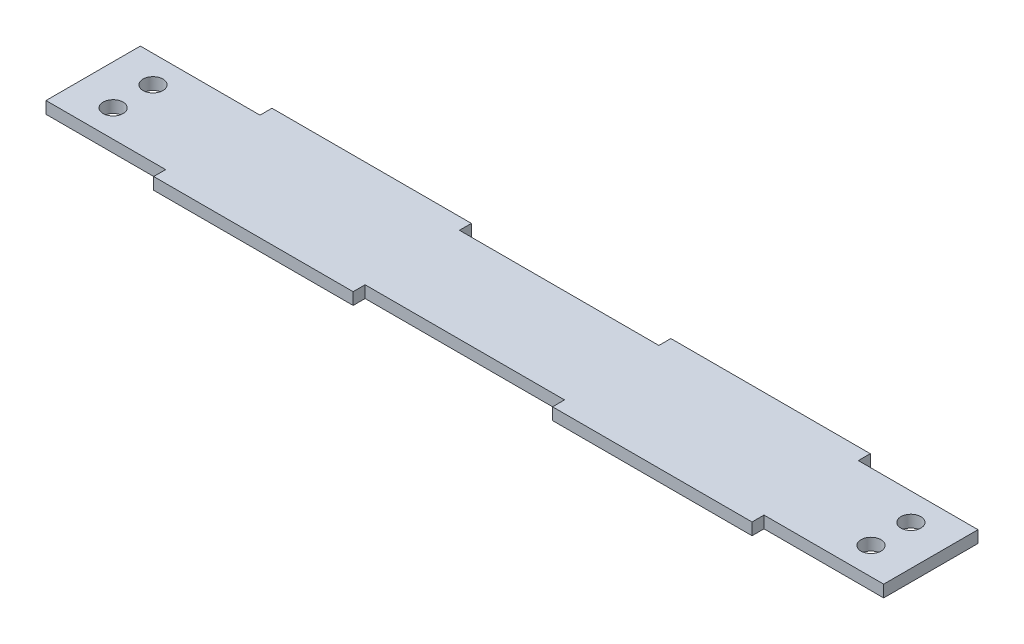
ISO-10303-21;
HEADER;
FILE_DESCRIPTION(('STEP AP214'),'2;1');
FILE_NAME('part.step','',(''),(''),'','','');
FILE_SCHEMA(('AUTOMOTIVE_DESIGN { 1 0 10303 214 1 1 1 1 }'));
ENDSEC;
DATA;
#1=APPLICATION_CONTEXT('core data for automotive mechanical design processes');
#2=APPLICATION_PROTOCOL_DEFINITION('international standard','automotive_design',2000,#1);
#3=PRODUCT_CONTEXT('',#1,'mechanical');
#4=PRODUCT('Part','Part','',(#3));
#5=PRODUCT_RELATED_PRODUCT_CATEGORY('part','',(#4));
#6=PRODUCT_DEFINITION_FORMATION('','',#4);
#7=PRODUCT_DEFINITION_CONTEXT('part definition',#1,'design');
#8=PRODUCT_DEFINITION('design','',#6,#7);
#9=PRODUCT_DEFINITION_SHAPE('','',#8);
#10=(LENGTH_UNIT() NAMED_UNIT(*) SI_UNIT(.MILLI.,.METRE.));
#11=(NAMED_UNIT(*) PLANE_ANGLE_UNIT() SI_UNIT($,.RADIAN.));
#12=(NAMED_UNIT(*) SI_UNIT($,.STERADIAN.) SOLID_ANGLE_UNIT());
#13=UNCERTAINTY_MEASURE_WITH_UNIT(LENGTH_MEASURE(1.E-05),#10,'distance_accuracy_value','');
#14=(GEOMETRIC_REPRESENTATION_CONTEXT(3) GLOBAL_UNCERTAINTY_ASSIGNED_CONTEXT((#13)) GLOBAL_UNIT_ASSIGNED_CONTEXT((#10,
#11,#12)) REPRESENTATION_CONTEXT('',''));
#15=CARTESIAN_POINT('',(0.,0.,0.));
#16=DIRECTION('',(0.,0.,1.));
#17=DIRECTION('',(1.,0.,0.));
#18=AXIS2_PLACEMENT_3D('',#15,#16,#17);
#19=CARTESIAN_POINT('',(0.,3.,0.));
#20=DIRECTION('',(0.,1.,0.));
#21=DIRECTION('',(0.,0.,1.));
#22=AXIS2_PLACEMENT_3D('',#19,#20,#21);
#23=PLANE('',#22);
#24=CARTESIAN_POINT('',(94.9999999999999,3.,-5.00000000000078));
#25=DIRECTION('',(0.,1.,0.));
#26=DIRECTION('',(0.,0.,1.));
#27=AXIS2_PLACEMENT_3D('',#24,#25,#26);
#28=CIRCLE('',#27,2.50000000000002);
#29=CARTESIAN_POINT('',(94.9999999999999,3.,-2.50000000000076));
#30=VERTEX_POINT('',#29);
#31=EDGE_CURVE('E397',#30,#30,#28,.T.);
#32=ORIENTED_EDGE('',*,*,#31,.F.);
#33=EDGE_LOOP('',(#32));
#34=FACE_BOUND('',#33,.T.);
#35=CARTESIAN_POINT('',(-95.,3.,-5.));
#36=DIRECTION('',(0.,1.,0.));
#37=DIRECTION('',(0.,0.,1.));
#38=AXIS2_PLACEMENT_3D('',#35,#36,#37);
#39=CIRCLE('',#38,2.50000000000001);
#40=CARTESIAN_POINT('',(-95.,3.,-2.49999999999999));
#41=VERTEX_POINT('',#40);
#42=EDGE_CURVE('E208',#41,#41,#39,.T.);
#43=ORIENTED_EDGE('',*,*,#42,.F.);
#44=EDGE_LOOP('',(#43));
#45=FACE_BOUND('',#44,.T.);
#46=DIRECTION('',(0.,0.,1.));
#47=VECTOR('',#46,1.);
#48=CARTESIAN_POINT('',(-105.,3.,-11.825));
#49=LINE('',#48,#47);
#50=CARTESIAN_POINT('',(-105.,3.,-11.825));
#51=VERTEX_POINT('',#50);
#52=CARTESIAN_POINT('',(-105.,3.,11.8250000000001));
#53=VERTEX_POINT('',#52);
#54=EDGE_CURVE('E243',#51,#53,#49,.T.);
#55=ORIENTED_EDGE('',*,*,#54,.T.);
#56=DIRECTION('',(1.,0.,0.));
#57=VECTOR('',#56,1.);
#58=CARTESIAN_POINT('',(-105.,3.,11.8250000000001));
#59=LINE('',#58,#57);
#60=CARTESIAN_POINT('',(-75.,3.,11.8250000000001));
#61=VERTEX_POINT('',#60);
#62=EDGE_CURVE('E131',#53,#61,#59,.T.);
#63=ORIENTED_EDGE('',*,*,#62,.T.);
#64=DIRECTION('',(0.,0.,1.));
#65=VECTOR('',#64,1.);
#66=CARTESIAN_POINT('',(-75.,3.,11.8250000000001));
#67=LINE('',#66,#65);
#68=CARTESIAN_POINT('',(-75.,3.,14.8250000000001));
#69=VERTEX_POINT('',#68);
#70=EDGE_CURVE('E294',#61,#69,#67,.T.);
#71=ORIENTED_EDGE('',*,*,#70,.T.);
#72=DIRECTION('',(1.,0.,0.));
#73=VECTOR('',#72,1.);
#74=CARTESIAN_POINT('',(-75.,3.,14.8250000000001));
#75=LINE('',#74,#73);
#76=CARTESIAN_POINT('',(-25.,3.,14.825));
#77=VERTEX_POINT('',#76);
#78=EDGE_CURVE('E313',#69,#77,#75,.T.);
#79=ORIENTED_EDGE('',*,*,#78,.T.);
#80=DIRECTION('',(0.,0.,-1.));
#81=VECTOR('',#80,1.);
#82=CARTESIAN_POINT('',(-25.,3.,14.825));
#83=LINE('',#82,#81);
#84=CARTESIAN_POINT('',(-25.,3.,11.825));
#85=VERTEX_POINT('',#84);
#86=EDGE_CURVE('E310',#77,#85,#83,.T.);
#87=ORIENTED_EDGE('',*,*,#86,.T.);
#88=DIRECTION('',(1.,0.,0.));
#89=VECTOR('',#88,1.);
#90=CARTESIAN_POINT('',(-25.,3.,11.825));
#91=LINE('',#90,#89);
#92=CARTESIAN_POINT('',(25.0000000000001,3.,11.825));
#93=VERTEX_POINT('',#92);
#94=EDGE_CURVE('E312',#85,#93,#91,.T.);
#95=ORIENTED_EDGE('',*,*,#94,.T.);
#96=DIRECTION('',(0.,0.,1.));
#97=VECTOR('',#96,1.);
#98=CARTESIAN_POINT('',(25.0000000000001,3.,11.825));
#99=LINE('',#98,#97);
#100=CARTESIAN_POINT('',(25.0000000000001,3.,14.825));
#101=VERTEX_POINT('',#100);
#102=EDGE_CURVE('E315',#93,#101,#99,.T.);
#103=ORIENTED_EDGE('',*,*,#102,.T.);
#104=DIRECTION('',(1.,0.,0.));
#105=VECTOR('',#104,1.);
#106=CARTESIAN_POINT('',(25.0000000000001,3.,14.825));
#107=LINE('',#106,#105);
#108=CARTESIAN_POINT('',(75.0000000000001,3.,14.825));
#109=VERTEX_POINT('',#108);
#110=EDGE_CURVE('E321',#101,#109,#107,.T.);
#111=ORIENTED_EDGE('',*,*,#110,.T.);
#112=DIRECTION('',(0.,0.,-1.));
#113=VECTOR('',#112,1.);
#114=CARTESIAN_POINT('',(75.0000000000001,3.,14.825));
#115=LINE('',#114,#113);
#116=CARTESIAN_POINT('',(75.0000000000001,3.,11.825));
#117=VERTEX_POINT('',#116);
#118=EDGE_CURVE('E323',#109,#117,#115,.T.);
#119=ORIENTED_EDGE('',*,*,#118,.T.);
#120=DIRECTION('',(1.,0.,0.));
#121=VECTOR('',#120,1.);
#122=CARTESIAN_POINT('',(75.0000000000001,3.,11.825));
#123=LINE('',#122,#121);
#124=CARTESIAN_POINT('',(105.,3.,11.825));
#125=VERTEX_POINT('',#124);
#126=EDGE_CURVE('E325',#117,#125,#123,.T.);
#127=ORIENTED_EDGE('',*,*,#126,.T.);
#128=DIRECTION('',(0.,0.,-1.));
#129=VECTOR('',#128,1.);
#130=CARTESIAN_POINT('',(105.,3.,11.825));
#131=LINE('',#130,#129);
#132=CARTESIAN_POINT('',(105.,3.,-11.825));
#133=VERTEX_POINT('',#132);
#134=EDGE_CURVE('E327',#125,#133,#131,.T.);
#135=ORIENTED_EDGE('',*,*,#134,.T.);
#136=DIRECTION('',(-1.,0.,0.));
#137=VECTOR('',#136,1.);
#138=CARTESIAN_POINT('',(105.,3.,-11.825));
#139=LINE('',#138,#137);
#140=CARTESIAN_POINT('',(75.0000000000001,3.,-11.825));
#141=VERTEX_POINT('',#140);
#142=EDGE_CURVE('E329',#133,#141,#139,.T.);
#143=ORIENTED_EDGE('',*,*,#142,.T.);
#144=DIRECTION('',(0.,0.,-1.));
#145=VECTOR('',#144,1.);
#146=CARTESIAN_POINT('',(75.0000000000001,3.,-11.825));
#147=LINE('',#146,#145);
#148=CARTESIAN_POINT('',(75.0000000000001,3.,-14.825));
#149=VERTEX_POINT('',#148);
#150=EDGE_CURVE('E331',#141,#149,#147,.T.);
#151=ORIENTED_EDGE('',*,*,#150,.T.);
#152=DIRECTION('',(-1.,0.,0.));
#153=VECTOR('',#152,1.);
#154=CARTESIAN_POINT('',(75.0000000000001,3.,-14.825));
#155=LINE('',#154,#153);
#156=CARTESIAN_POINT('',(25.0000000000001,3.,-14.825));
#157=VERTEX_POINT('',#156);
#158=EDGE_CURVE('E333',#149,#157,#155,.T.);
#159=ORIENTED_EDGE('',*,*,#158,.T.);
#160=DIRECTION('',(0.,0.,1.));
#161=VECTOR('',#160,1.);
#162=CARTESIAN_POINT('',(25.0000000000001,3.,-14.825));
#163=LINE('',#162,#161);
#164=CARTESIAN_POINT('',(25.0000000000001,3.,-11.825));
#165=VERTEX_POINT('',#164);
#166=EDGE_CURVE('E335',#157,#165,#163,.T.);
#167=ORIENTED_EDGE('',*,*,#166,.T.);
#168=DIRECTION('',(-1.,0.,0.));
#169=VECTOR('',#168,1.);
#170=CARTESIAN_POINT('',(25.0000000000001,3.,-11.825));
#171=LINE('',#170,#169);
#172=CARTESIAN_POINT('',(-25.,3.,-11.825));
#173=VERTEX_POINT('',#172);
#174=EDGE_CURVE('E337',#165,#173,#171,.T.);
#175=ORIENTED_EDGE('',*,*,#174,.T.);
#176=DIRECTION('',(0.,0.,-1.));
#177=VECTOR('',#176,1.);
#178=CARTESIAN_POINT('',(-25.,3.,-11.825));
#179=LINE('',#178,#177);
#180=CARTESIAN_POINT('',(-25.,3.,-14.825));
#181=VERTEX_POINT('',#180);
#182=EDGE_CURVE('E186',#173,#181,#179,.T.);
#183=ORIENTED_EDGE('',*,*,#182,.T.);
#184=DIRECTION('',(-1.,0.,0.));
#185=VECTOR('',#184,1.);
#186=CARTESIAN_POINT('',(-25.,3.,-14.825));
#187=LINE('',#186,#185);
#188=CARTESIAN_POINT('',(-75.,3.,-14.825));
#189=VERTEX_POINT('',#188);
#190=EDGE_CURVE('E180',#181,#189,#187,.T.);
#191=ORIENTED_EDGE('',*,*,#190,.T.);
#192=DIRECTION('',(0.,0.,1.));
#193=VECTOR('',#192,1.);
#194=CARTESIAN_POINT('',(-75.,3.,-14.825));
#195=LINE('',#194,#193);
#196=CARTESIAN_POINT('',(-75.,3.,-11.825));
#197=VERTEX_POINT('',#196);
#198=EDGE_CURVE('E184',#189,#197,#195,.T.);
#199=ORIENTED_EDGE('',*,*,#198,.T.);
#200=DIRECTION('',(-1.,0.,0.));
#201=VECTOR('',#200,1.);
#202=CARTESIAN_POINT('',(-75.,3.,-11.825));
#203=LINE('',#202,#201);
#204=EDGE_CURVE('E52',#197,#51,#203,.T.);
#205=ORIENTED_EDGE('',*,*,#204,.T.);
#206=EDGE_LOOP('',(#55,#63,#71,#79,#87,#95,#103,#111,#119,#127,#135,#143,#151,#159,#167,#175,
#183,#191,#199,#205));
#207=FACE_BOUND('',#206,.T.);
#208=CARTESIAN_POINT('',(-95.,3.,5.));
#209=DIRECTION('',(0.,1.,0.));
#210=DIRECTION('',(0.,0.,1.));
#211=AXIS2_PLACEMENT_3D('',#208,#209,#210);
#212=CIRCLE('',#211,2.50000000000001);
#213=CARTESIAN_POINT('',(-95.,3.,7.50000000000001));
#214=VERTEX_POINT('',#213);
#215=EDGE_CURVE('E403',#214,#214,#212,.T.);
#216=ORIENTED_EDGE('',*,*,#215,.F.);
#217=EDGE_LOOP('',(#216));
#218=FACE_BOUND('',#217,.T.);
#219=CARTESIAN_POINT('',(95.,3.,4.99999999999922));
#220=DIRECTION('',(0.,1.,0.));
#221=DIRECTION('',(0.,0.,1.));
#222=AXIS2_PLACEMENT_3D('',#219,#220,#221);
#223=CIRCLE('',#222,2.50000000000001);
#224=CARTESIAN_POINT('',(95.,3.,7.49999999999923));
#225=VERTEX_POINT('',#224);
#226=EDGE_CURVE('E388',#225,#225,#223,.T.);
#227=ORIENTED_EDGE('',*,*,#226,.F.);
#228=EDGE_LOOP('',(#227));
#229=FACE_BOUND('',#228,.T.);
#230=ADVANCED_FACE('F35',(#34,#45,#207,#218,#229),#23,.T.);
#231=CARTESIAN_POINT('',(0.,0.,0.));
#232=DIRECTION('',(0.,1.,0.));
#233=DIRECTION('',(0.,0.,1.));
#234=AXIS2_PLACEMENT_3D('',#231,#232,#233);
#235=PLANE('',#234);
#236=DIRECTION('',(0.,0.,1.));
#237=VECTOR('',#236,1.);
#238=CARTESIAN_POINT('',(-105.,0.,-11.825));
#239=LINE('',#238,#237);
#240=CARTESIAN_POINT('',(-105.,0.,-11.825));
#241=VERTEX_POINT('',#240);
#242=CARTESIAN_POINT('',(-105.,0.,11.8250000000001));
#243=VERTEX_POINT('',#242);
#244=EDGE_CURVE('E204',#241,#243,#239,.T.);
#245=ORIENTED_EDGE('',*,*,#244,.F.);
#246=DIRECTION('',(-1.,0.,0.));
#247=VECTOR('',#246,1.);
#248=CARTESIAN_POINT('',(-75.,0.,-11.825));
#249=LINE('',#248,#247);
#250=CARTESIAN_POINT('',(-75.,0.,-11.825));
#251=VERTEX_POINT('',#250);
#252=EDGE_CURVE('E123',#251,#241,#249,.T.);
#253=ORIENTED_EDGE('',*,*,#252,.F.);
#254=DIRECTION('',(0.,0.,1.));
#255=VECTOR('',#254,1.);
#256=CARTESIAN_POINT('',(-75.,0.,-14.825));
#257=LINE('',#256,#255);
#258=CARTESIAN_POINT('',(-75.,0.,-14.825));
#259=VERTEX_POINT('',#258);
#260=EDGE_CURVE('E117',#259,#251,#257,.T.);
#261=ORIENTED_EDGE('',*,*,#260,.F.);
#262=DIRECTION('',(-1.,0.,0.));
#263=VECTOR('',#262,1.);
#264=CARTESIAN_POINT('',(-25.,0.,-14.825));
#265=LINE('',#264,#263);
#266=CARTESIAN_POINT('',(-25.,0.,-14.825));
#267=VERTEX_POINT('',#266);
#268=EDGE_CURVE('E194',#267,#259,#265,.T.);
#269=ORIENTED_EDGE('',*,*,#268,.F.);
#270=DIRECTION('',(0.,0.,-1.));
#271=VECTOR('',#270,1.);
#272=CARTESIAN_POINT('',(-25.,0.,-11.825));
#273=LINE('',#272,#271);
#274=CARTESIAN_POINT('',(-25.,0.,-11.825));
#275=VERTEX_POINT('',#274);
#276=EDGE_CURVE('E238',#275,#267,#273,.T.);
#277=ORIENTED_EDGE('',*,*,#276,.F.);
#278=DIRECTION('',(-1.,0.,0.));
#279=VECTOR('',#278,1.);
#280=CARTESIAN_POINT('',(25.0000000000001,0.,-11.825));
#281=LINE('',#280,#279);
#282=CARTESIAN_POINT('',(25.0000000000001,0.,-11.825));
#283=VERTEX_POINT('',#282);
#284=EDGE_CURVE('E236',#283,#275,#281,.T.);
#285=ORIENTED_EDGE('',*,*,#284,.F.);
#286=DIRECTION('',(0.,0.,1.));
#287=VECTOR('',#286,1.);
#288=CARTESIAN_POINT('',(25.0000000000001,0.,-14.825));
#289=LINE('',#288,#287);
#290=CARTESIAN_POINT('',(25.0000000000001,0.,-14.825));
#291=VERTEX_POINT('',#290);
#292=EDGE_CURVE('E234',#291,#283,#289,.T.);
#293=ORIENTED_EDGE('',*,*,#292,.F.);
#294=DIRECTION('',(-1.,0.,0.));
#295=VECTOR('',#294,1.);
#296=CARTESIAN_POINT('',(75.0000000000001,0.,-14.825));
#297=LINE('',#296,#295);
#298=CARTESIAN_POINT('',(75.0000000000001,0.,-14.825));
#299=VERTEX_POINT('',#298);
#300=EDGE_CURVE('E232',#299,#291,#297,.T.);
#301=ORIENTED_EDGE('',*,*,#300,.F.);
#302=DIRECTION('',(0.,0.,-1.));
#303=VECTOR('',#302,1.);
#304=CARTESIAN_POINT('',(75.0000000000001,0.,-11.825));
#305=LINE('',#304,#303);
#306=CARTESIAN_POINT('',(75.0000000000001,0.,-11.825));
#307=VERTEX_POINT('',#306);
#308=EDGE_CURVE('E230',#307,#299,#305,.T.);
#309=ORIENTED_EDGE('',*,*,#308,.F.);
#310=DIRECTION('',(-1.,0.,0.));
#311=VECTOR('',#310,1.);
#312=CARTESIAN_POINT('',(105.,0.,-11.825));
#313=LINE('',#312,#311);
#314=CARTESIAN_POINT('',(105.,0.,-11.825));
#315=VERTEX_POINT('',#314);
#316=EDGE_CURVE('E228',#315,#307,#313,.T.);
#317=ORIENTED_EDGE('',*,*,#316,.F.);
#318=DIRECTION('',(0.,0.,-1.));
#319=VECTOR('',#318,1.);
#320=CARTESIAN_POINT('',(105.,0.,11.825));
#321=LINE('',#320,#319);
#322=CARTESIAN_POINT('',(105.,0.,11.825));
#323=VERTEX_POINT('',#322);
#324=EDGE_CURVE('E226',#323,#315,#321,.T.);
#325=ORIENTED_EDGE('',*,*,#324,.F.);
#326=DIRECTION('',(1.,0.,0.));
#327=VECTOR('',#326,1.);
#328=CARTESIAN_POINT('',(75.0000000000001,0.,11.825));
#329=LINE('',#328,#327);
#330=CARTESIAN_POINT('',(75.0000000000001,0.,11.825));
#331=VERTEX_POINT('',#330);
#332=EDGE_CURVE('E224',#331,#323,#329,.T.);
#333=ORIENTED_EDGE('',*,*,#332,.F.);
#334=DIRECTION('',(0.,0.,-1.));
#335=VECTOR('',#334,1.);
#336=CARTESIAN_POINT('',(75.0000000000001,0.,14.825));
#337=LINE('',#336,#335);
#338=CARTESIAN_POINT('',(75.0000000000001,0.,14.825));
#339=VERTEX_POINT('',#338);
#340=EDGE_CURVE('E222',#339,#331,#337,.T.);
#341=ORIENTED_EDGE('',*,*,#340,.F.);
#342=DIRECTION('',(1.,0.,0.));
#343=VECTOR('',#342,1.);
#344=CARTESIAN_POINT('',(25.0000000000001,0.,14.825));
#345=LINE('',#344,#343);
#346=CARTESIAN_POINT('',(25.0000000000001,0.,14.825));
#347=VERTEX_POINT('',#346);
#348=EDGE_CURVE('E220',#347,#339,#345,.T.);
#349=ORIENTED_EDGE('',*,*,#348,.F.);
#350=DIRECTION('',(0.,0.,1.));
#351=VECTOR('',#350,1.);
#352=CARTESIAN_POINT('',(25.0000000000001,0.,11.825));
#353=LINE('',#352,#351);
#354=CARTESIAN_POINT('',(25.0000000000001,0.,11.825));
#355=VERTEX_POINT('',#354);
#356=EDGE_CURVE('E218',#355,#347,#353,.T.);
#357=ORIENTED_EDGE('',*,*,#356,.F.);
#358=DIRECTION('',(1.,0.,0.));
#359=VECTOR('',#358,1.);
#360=CARTESIAN_POINT('',(-25.,0.,11.825));
#361=LINE('',#360,#359);
#362=CARTESIAN_POINT('',(-25.,0.,11.825));
#363=VERTEX_POINT('',#362);
#364=EDGE_CURVE('E216',#363,#355,#361,.T.);
#365=ORIENTED_EDGE('',*,*,#364,.F.);
#366=DIRECTION('',(0.,0.,-1.));
#367=VECTOR('',#366,1.);
#368=CARTESIAN_POINT('',(-25.,0.,14.825));
#369=LINE('',#368,#367);
#370=CARTESIAN_POINT('',(-25.,0.,14.825));
#371=VERTEX_POINT('',#370);
#372=EDGE_CURVE('E214',#371,#363,#369,.T.);
#373=ORIENTED_EDGE('',*,*,#372,.F.);
#374=DIRECTION('',(1.,0.,0.));
#375=VECTOR('',#374,1.);
#376=CARTESIAN_POINT('',(-75.,0.,14.8250000000001));
#377=LINE('',#376,#375);
#378=CARTESIAN_POINT('',(-75.,0.,14.8250000000001));
#379=VERTEX_POINT('',#378);
#380=EDGE_CURVE('E212',#379,#371,#377,.T.);
#381=ORIENTED_EDGE('',*,*,#380,.F.);
#382=DIRECTION('',(0.,0.,1.));
#383=VECTOR('',#382,1.);
#384=CARTESIAN_POINT('',(-75.,0.,11.8250000000001));
#385=LINE('',#384,#383);
#386=CARTESIAN_POINT('',(-75.,0.,11.8250000000001));
#387=VERTEX_POINT('',#386);
#388=EDGE_CURVE('E210',#387,#379,#385,.T.);
#389=ORIENTED_EDGE('',*,*,#388,.F.);
#390=DIRECTION('',(1.,0.,0.));
#391=VECTOR('',#390,1.);
#392=CARTESIAN_POINT('',(-105.,0.,11.8250000000001));
#393=LINE('',#392,#391);
#394=EDGE_CURVE('E207',#243,#387,#393,.T.);
#395=ORIENTED_EDGE('',*,*,#394,.F.);
#396=EDGE_LOOP('',(#245,#253,#261,#269,#277,#285,#293,#301,#309,#317,#325,#333,#341,#349,#357,
#365,#373,#381,#389,#395));
#397=FACE_BOUND('',#396,.T.);
#398=CARTESIAN_POINT('',(-95.,0.,-5.));
#399=DIRECTION('',(0.,1.,0.));
#400=DIRECTION('',(0.,0.,1.));
#401=AXIS2_PLACEMENT_3D('',#398,#399,#400);
#402=CIRCLE('',#401,2.50000000000001);
#403=CARTESIAN_POINT('',(-95.,0.,-2.49999999999999));
#404=VERTEX_POINT('',#403);
#405=EDGE_CURVE('E406',#404,#404,#402,.T.);
#406=ORIENTED_EDGE('',*,*,#405,.T.);
#407=EDGE_LOOP('',(#406));
#408=FACE_BOUND('',#407,.T.);
#409=CARTESIAN_POINT('',(-95.,0.,5.));
#410=DIRECTION('',(0.,1.,0.));
#411=DIRECTION('',(0.,0.,1.));
#412=AXIS2_PLACEMENT_3D('',#409,#410,#411);
#413=CIRCLE('',#412,2.50000000000001);
#414=CARTESIAN_POINT('',(-95.,0.,7.50000000000001));
#415=VERTEX_POINT('',#414);
#416=EDGE_CURVE('E400',#415,#415,#413,.T.);
#417=ORIENTED_EDGE('',*,*,#416,.T.);
#418=EDGE_LOOP('',(#417));
#419=FACE_BOUND('',#418,.T.);
#420=CARTESIAN_POINT('',(94.9999999999999,0.,-5.00000000000078));
#421=DIRECTION('',(0.,1.,0.));
#422=DIRECTION('',(0.,0.,1.));
#423=AXIS2_PLACEMENT_3D('',#420,#421,#422);
#424=CIRCLE('',#423,2.50000000000002);
#425=CARTESIAN_POINT('',(94.9999999999999,0.,-2.50000000000076));
#426=VERTEX_POINT('',#425);
#427=EDGE_CURVE('E394',#426,#426,#424,.T.);
#428=ORIENTED_EDGE('',*,*,#427,.T.);
#429=EDGE_LOOP('',(#428));
#430=FACE_BOUND('',#429,.T.);
#431=CARTESIAN_POINT('',(95.,0.,4.99999999999922));
#432=DIRECTION('',(0.,1.,0.));
#433=DIRECTION('',(0.,0.,1.));
#434=AXIS2_PLACEMENT_3D('',#431,#432,#433);
#435=CIRCLE('',#434,2.50000000000001);
#436=CARTESIAN_POINT('',(95.,0.,7.49999999999923));
#437=VERTEX_POINT('',#436);
#438=EDGE_CURVE('E391',#437,#437,#435,.T.);
#439=ORIENTED_EDGE('',*,*,#438,.T.);
#440=EDGE_LOOP('',(#439));
#441=FACE_BOUND('',#440,.T.);
#442=ADVANCED_FACE('F298',(#397,#408,#419,#430,#441),#235,.F.);
#443=CARTESIAN_POINT('',(-105.,3.,-11.825));
#444=DIRECTION('',(1.,0.,0.));
#445=DIRECTION('',(0.,0.,-1.));
#446=AXIS2_PLACEMENT_3D('',#443,#444,#445);
#447=PLANE('',#446);
#448=ORIENTED_EDGE('',*,*,#244,.T.);
#449=DIRECTION('',(0.,-1.,0.));
#450=VECTOR('',#449,1.);
#451=CARTESIAN_POINT('',(-105.,3.,11.8250000000001));
#452=LINE('',#451,#450);
#453=EDGE_CURVE('E11',#53,#243,#452,.T.);
#454=ORIENTED_EDGE('',*,*,#453,.F.);
#455=ORIENTED_EDGE('',*,*,#54,.F.);
#456=DIRECTION('',(0.,-1.,0.));
#457=VECTOR('',#456,1.);
#458=CARTESIAN_POINT('',(-105.,3.,-11.825));
#459=LINE('',#458,#457);
#460=EDGE_CURVE('E200',#51,#241,#459,.T.);
#461=ORIENTED_EDGE('',*,*,#460,.T.);
#462=EDGE_LOOP('',(#448,#454,#455,#461));
#463=FACE_BOUND('',#462,.T.);
#464=ADVANCED_FACE('F37',(#463),#447,.F.);
#465=CARTESIAN_POINT('',(-105.,3.,11.8250000000001));
#466=DIRECTION('',(0.,0.,-1.));
#467=DIRECTION('',(-1.,0.,0.));
#468=AXIS2_PLACEMENT_3D('',#465,#466,#467);
#469=PLANE('',#468);
#470=ORIENTED_EDGE('',*,*,#394,.T.);
#471=DIRECTION('',(0.,-1.,0.));
#472=VECTOR('',#471,1.);
#473=CARTESIAN_POINT('',(-75.,3.,11.8250000000001));
#474=LINE('',#473,#472);
#475=EDGE_CURVE('E44',#61,#387,#474,.T.);
#476=ORIENTED_EDGE('',*,*,#475,.F.);
#477=ORIENTED_EDGE('',*,*,#62,.F.);
#478=ORIENTED_EDGE('',*,*,#453,.T.);
#479=EDGE_LOOP('',(#470,#476,#477,#478));
#480=FACE_BOUND('',#479,.T.);
#481=ADVANCED_FACE('F596',(#480),#469,.F.);
#482=CARTESIAN_POINT('',(-75.,3.,11.8250000000001));
#483=DIRECTION('',(1.,0.,0.));
#484=DIRECTION('',(0.,0.,-1.));
#485=AXIS2_PLACEMENT_3D('',#482,#483,#484);
#486=PLANE('',#485);
#487=ORIENTED_EDGE('',*,*,#388,.T.);
#488=DIRECTION('',(0.,-1.,0.));
#489=VECTOR('',#488,1.);
#490=CARTESIAN_POINT('',(-75.,3.,14.8250000000001));
#491=LINE('',#490,#489);
#492=EDGE_CURVE('E286',#69,#379,#491,.T.);
#493=ORIENTED_EDGE('',*,*,#492,.F.);
#494=ORIENTED_EDGE('',*,*,#70,.F.);
#495=ORIENTED_EDGE('',*,*,#475,.T.);
#496=EDGE_LOOP('',(#487,#493,#494,#495));
#497=FACE_BOUND('',#496,.T.);
#498=ADVANCED_FACE('F292',(#497),#486,.F.);
#499=CARTESIAN_POINT('',(-75.,3.,14.8250000000001));
#500=DIRECTION('',(0.,0.,-1.));
#501=DIRECTION('',(-1.,0.,0.));
#502=AXIS2_PLACEMENT_3D('',#499,#500,#501);
#503=PLANE('',#502);
#504=ORIENTED_EDGE('',*,*,#380,.T.);
#505=DIRECTION('',(0.,-1.,0.));
#506=VECTOR('',#505,1.);
#507=CARTESIAN_POINT('',(-25.,3.,14.825));
#508=LINE('',#507,#506);
#509=EDGE_CURVE('E283',#77,#371,#508,.T.);
#510=ORIENTED_EDGE('',*,*,#509,.F.);
#511=ORIENTED_EDGE('',*,*,#78,.F.);
#512=ORIENTED_EDGE('',*,*,#492,.T.);
#513=EDGE_LOOP('',(#504,#510,#511,#512));
#514=FACE_BOUND('',#513,.T.);
#515=ADVANCED_FACE('F304',(#514),#503,.F.);
#516=CARTESIAN_POINT('',(-25.,3.,14.825));
#517=DIRECTION('',(-1.,0.,0.));
#518=DIRECTION('',(0.,0.,1.));
#519=AXIS2_PLACEMENT_3D('',#516,#517,#518);
#520=PLANE('',#519);
#521=ORIENTED_EDGE('',*,*,#372,.T.);
#522=DIRECTION('',(0.,-1.,0.));
#523=VECTOR('',#522,1.);
#524=CARTESIAN_POINT('',(-25.,3.,11.825));
#525=LINE('',#524,#523);
#526=EDGE_CURVE('E280',#85,#363,#525,.T.);
#527=ORIENTED_EDGE('',*,*,#526,.F.);
#528=ORIENTED_EDGE('',*,*,#86,.F.);
#529=ORIENTED_EDGE('',*,*,#509,.T.);
#530=EDGE_LOOP('',(#521,#527,#528,#529));
#531=FACE_BOUND('',#530,.T.);
#532=ADVANCED_FACE('F308',(#531),#520,.F.);
#533=CARTESIAN_POINT('',(-25.,3.,11.825));
#534=DIRECTION('',(0.,0.,-1.));
#535=DIRECTION('',(-1.,0.,0.));
#536=AXIS2_PLACEMENT_3D('',#533,#534,#535);
#537=PLANE('',#536);
#538=ORIENTED_EDGE('',*,*,#364,.T.);
#539=DIRECTION('',(0.,-1.,0.));
#540=VECTOR('',#539,1.);
#541=CARTESIAN_POINT('',(25.0000000000001,3.,11.825));
#542=LINE('',#541,#540);
#543=EDGE_CURVE('E277',#93,#355,#542,.T.);
#544=ORIENTED_EDGE('',*,*,#543,.F.);
#545=ORIENTED_EDGE('',*,*,#94,.F.);
#546=ORIENTED_EDGE('',*,*,#526,.T.);
#547=EDGE_LOOP('',(#538,#544,#545,#546));
#548=FACE_BOUND('',#547,.T.);
#549=ADVANCED_FACE('F561',(#548),#537,.F.);
#550=CARTESIAN_POINT('',(25.0000000000001,3.,11.825));
#551=DIRECTION('',(1.,0.,0.));
#552=DIRECTION('',(0.,0.,-1.));
#553=AXIS2_PLACEMENT_3D('',#550,#551,#552);
#554=PLANE('',#553);
#555=ORIENTED_EDGE('',*,*,#356,.T.);
#556=DIRECTION('',(0.,-1.,0.));
#557=VECTOR('',#556,1.);
#558=CARTESIAN_POINT('',(25.0000000000001,3.,14.825));
#559=LINE('',#558,#557);
#560=EDGE_CURVE('E274',#101,#347,#559,.T.);
#561=ORIENTED_EDGE('',*,*,#560,.F.);
#562=ORIENTED_EDGE('',*,*,#102,.F.);
#563=ORIENTED_EDGE('',*,*,#543,.T.);
#564=EDGE_LOOP('',(#555,#561,#562,#563));
#565=FACE_BOUND('',#564,.T.);
#566=ADVANCED_FACE('F551',(#565),#554,.F.);
#567=CARTESIAN_POINT('',(25.0000000000001,3.,14.825));
#568=DIRECTION('',(0.,0.,-1.));
#569=DIRECTION('',(-1.,0.,0.));
#570=AXIS2_PLACEMENT_3D('',#567,#568,#569);
#571=PLANE('',#570);
#572=ORIENTED_EDGE('',*,*,#348,.T.);
#573=DIRECTION('',(0.,-1.,0.));
#574=VECTOR('',#573,1.);
#575=CARTESIAN_POINT('',(75.0000000000001,3.,14.825));
#576=LINE('',#575,#574);
#577=EDGE_CURVE('E271',#109,#339,#576,.T.);
#578=ORIENTED_EDGE('',*,*,#577,.F.);
#579=ORIENTED_EDGE('',*,*,#110,.F.);
#580=ORIENTED_EDGE('',*,*,#560,.T.);
#581=EDGE_LOOP('',(#572,#578,#579,#580));
#582=FACE_BOUND('',#581,.T.);
#583=ADVANCED_FACE('F541',(#582),#571,.F.);
#584=CARTESIAN_POINT('',(75.0000000000001,3.,14.825));
#585=DIRECTION('',(-1.,0.,0.));
#586=DIRECTION('',(0.,0.,1.));
#587=AXIS2_PLACEMENT_3D('',#584,#585,#586);
#588=PLANE('',#587);
#589=ORIENTED_EDGE('',*,*,#340,.T.);
#590=DIRECTION('',(0.,-1.,0.));
#591=VECTOR('',#590,1.);
#592=CARTESIAN_POINT('',(75.0000000000001,3.,11.825));
#593=LINE('',#592,#591);
#594=EDGE_CURVE('E268',#117,#331,#593,.T.);
#595=ORIENTED_EDGE('',*,*,#594,.F.);
#596=ORIENTED_EDGE('',*,*,#118,.F.);
#597=ORIENTED_EDGE('',*,*,#577,.T.);
#598=EDGE_LOOP('',(#589,#595,#596,#597));
#599=FACE_BOUND('',#598,.T.);
#600=ADVANCED_FACE('F531',(#599),#588,.F.);
#601=CARTESIAN_POINT('',(75.0000000000001,3.,11.825));
#602=DIRECTION('',(0.,0.,-1.));
#603=DIRECTION('',(-1.,0.,0.));
#604=AXIS2_PLACEMENT_3D('',#601,#602,#603);
#605=PLANE('',#604);
#606=ORIENTED_EDGE('',*,*,#332,.T.);
#607=DIRECTION('',(0.,-1.,0.));
#608=VECTOR('',#607,1.);
#609=CARTESIAN_POINT('',(105.,3.,11.825));
#610=LINE('',#609,#608);
#611=EDGE_CURVE('E265',#125,#323,#610,.T.);
#612=ORIENTED_EDGE('',*,*,#611,.F.);
#613=ORIENTED_EDGE('',*,*,#126,.F.);
#614=ORIENTED_EDGE('',*,*,#594,.T.);
#615=EDGE_LOOP('',(#606,#612,#613,#614));
#616=FACE_BOUND('',#615,.T.);
#617=ADVANCED_FACE('F521',(#616),#605,.F.);
#618=CARTESIAN_POINT('',(105.,3.,11.825));
#619=DIRECTION('',(-1.,0.,0.));
#620=DIRECTION('',(0.,0.,1.));
#621=AXIS2_PLACEMENT_3D('',#618,#619,#620);
#622=PLANE('',#621);
#623=ORIENTED_EDGE('',*,*,#324,.T.);
#624=DIRECTION('',(0.,-1.,0.));
#625=VECTOR('',#624,1.);
#626=CARTESIAN_POINT('',(105.,3.,-11.825));
#627=LINE('',#626,#625);
#628=EDGE_CURVE('E262',#133,#315,#627,.T.);
#629=ORIENTED_EDGE('',*,*,#628,.F.);
#630=ORIENTED_EDGE('',*,*,#134,.F.);
#631=ORIENTED_EDGE('',*,*,#611,.T.);
#632=EDGE_LOOP('',(#623,#629,#630,#631));
#633=FACE_BOUND('',#632,.T.);
#634=ADVANCED_FACE('F511',(#633),#622,.F.);
#635=CARTESIAN_POINT('',(105.,3.,-11.825));
#636=DIRECTION('',(0.,0.,1.));
#637=DIRECTION('',(1.,0.,0.));
#638=AXIS2_PLACEMENT_3D('',#635,#636,#637);
#639=PLANE('',#638);
#640=ORIENTED_EDGE('',*,*,#316,.T.);
#641=DIRECTION('',(0.,-1.,0.));
#642=VECTOR('',#641,1.);
#643=CARTESIAN_POINT('',(75.0000000000001,3.,-11.825));
#644=LINE('',#643,#642);
#645=EDGE_CURVE('E259',#141,#307,#644,.T.);
#646=ORIENTED_EDGE('',*,*,#645,.F.);
#647=ORIENTED_EDGE('',*,*,#142,.F.);
#648=ORIENTED_EDGE('',*,*,#628,.T.);
#649=EDGE_LOOP('',(#640,#646,#647,#648));
#650=FACE_BOUND('',#649,.T.);
#651=ADVANCED_FACE('F501',(#650),#639,.F.);
#652=CARTESIAN_POINT('',(75.0000000000001,3.,-11.825));
#653=DIRECTION('',(-1.,0.,0.));
#654=DIRECTION('',(0.,0.,1.));
#655=AXIS2_PLACEMENT_3D('',#652,#653,#654);
#656=PLANE('',#655);
#657=ORIENTED_EDGE('',*,*,#308,.T.);
#658=DIRECTION('',(0.,-1.,0.));
#659=VECTOR('',#658,1.);
#660=CARTESIAN_POINT('',(75.0000000000001,3.,-14.825));
#661=LINE('',#660,#659);
#662=EDGE_CURVE('E256',#149,#299,#661,.T.);
#663=ORIENTED_EDGE('',*,*,#662,.F.);
#664=ORIENTED_EDGE('',*,*,#150,.F.);
#665=ORIENTED_EDGE('',*,*,#645,.T.);
#666=EDGE_LOOP('',(#657,#663,#664,#665));
#667=FACE_BOUND('',#666,.T.);
#668=ADVANCED_FACE('F491',(#667),#656,.F.);
#669=CARTESIAN_POINT('',(75.0000000000001,3.,-14.825));
#670=DIRECTION('',(0.,0.,1.));
#671=DIRECTION('',(1.,0.,0.));
#672=AXIS2_PLACEMENT_3D('',#669,#670,#671);
#673=PLANE('',#672);
#674=ORIENTED_EDGE('',*,*,#300,.T.);
#675=DIRECTION('',(0.,-1.,0.));
#676=VECTOR('',#675,1.);
#677=CARTESIAN_POINT('',(25.0000000000001,3.,-14.825));
#678=LINE('',#677,#676);
#679=EDGE_CURVE('E253',#157,#291,#678,.T.);
#680=ORIENTED_EDGE('',*,*,#679,.F.);
#681=ORIENTED_EDGE('',*,*,#158,.F.);
#682=ORIENTED_EDGE('',*,*,#662,.T.);
#683=EDGE_LOOP('',(#674,#680,#681,#682));
#684=FACE_BOUND('',#683,.T.);
#685=ADVANCED_FACE('F481',(#684),#673,.F.);
#686=CARTESIAN_POINT('',(25.0000000000001,3.,-14.825));
#687=DIRECTION('',(1.,0.,0.));
#688=DIRECTION('',(0.,0.,-1.));
#689=AXIS2_PLACEMENT_3D('',#686,#687,#688);
#690=PLANE('',#689);
#691=ORIENTED_EDGE('',*,*,#292,.T.);
#692=DIRECTION('',(0.,-1.,0.));
#693=VECTOR('',#692,1.);
#694=CARTESIAN_POINT('',(25.0000000000001,3.,-11.825));
#695=LINE('',#694,#693);
#696=EDGE_CURVE('E250',#165,#283,#695,.T.);
#697=ORIENTED_EDGE('',*,*,#696,.F.);
#698=ORIENTED_EDGE('',*,*,#166,.F.);
#699=ORIENTED_EDGE('',*,*,#679,.T.);
#700=EDGE_LOOP('',(#691,#697,#698,#699));
#701=FACE_BOUND('',#700,.T.);
#702=ADVANCED_FACE('F472',(#701),#690,.F.);
#703=CARTESIAN_POINT('',(25.0000000000001,3.,-11.825));
#704=DIRECTION('',(0.,0.,1.));
#705=DIRECTION('',(1.,0.,0.));
#706=AXIS2_PLACEMENT_3D('',#703,#704,#705);
#707=PLANE('',#706);
#708=ORIENTED_EDGE('',*,*,#284,.T.);
#709=DIRECTION('',(0.,-1.,0.));
#710=VECTOR('',#709,1.);
#711=CARTESIAN_POINT('',(-25.,3.,-11.825));
#712=LINE('',#711,#710);
#713=EDGE_CURVE('E247',#173,#275,#712,.T.);
#714=ORIENTED_EDGE('',*,*,#713,.F.);
#715=ORIENTED_EDGE('',*,*,#174,.F.);
#716=ORIENTED_EDGE('',*,*,#696,.T.);
#717=EDGE_LOOP('',(#708,#714,#715,#716));
#718=FACE_BOUND('',#717,.T.);
#719=ADVANCED_FACE('F343',(#718),#707,.F.);
#720=CARTESIAN_POINT('',(-25.,3.,-11.825));
#721=DIRECTION('',(-1.,0.,0.));
#722=DIRECTION('',(0.,0.,1.));
#723=AXIS2_PLACEMENT_3D('',#720,#721,#722);
#724=PLANE('',#723);
#725=ORIENTED_EDGE('',*,*,#276,.T.);
#726=DIRECTION('',(0.,-1.,0.));
#727=VECTOR('',#726,1.);
#728=CARTESIAN_POINT('',(-25.,3.,-14.825));
#729=LINE('',#728,#727);
#730=EDGE_CURVE('E195',#181,#267,#729,.T.);
#731=ORIENTED_EDGE('',*,*,#730,.F.);
#732=ORIENTED_EDGE('',*,*,#182,.F.);
#733=ORIENTED_EDGE('',*,*,#713,.T.);
#734=EDGE_LOOP('',(#725,#731,#732,#733));
#735=FACE_BOUND('',#734,.T.);
#736=ADVANCED_FACE('F347',(#735),#724,.F.);
#737=CARTESIAN_POINT('',(-25.,3.,-14.825));
#738=DIRECTION('',(0.,0.,1.));
#739=DIRECTION('',(1.,0.,0.));
#740=AXIS2_PLACEMENT_3D('',#737,#738,#739);
#741=PLANE('',#740);
#742=ORIENTED_EDGE('',*,*,#268,.T.);
#743=DIRECTION('',(0.,-1.,0.));
#744=VECTOR('',#743,1.);
#745=CARTESIAN_POINT('',(-75.,3.,-14.825));
#746=LINE('',#745,#744);
#747=EDGE_CURVE('E191',#189,#259,#746,.T.);
#748=ORIENTED_EDGE('',*,*,#747,.F.);
#749=ORIENTED_EDGE('',*,*,#190,.F.);
#750=ORIENTED_EDGE('',*,*,#730,.T.);
#751=EDGE_LOOP('',(#742,#748,#749,#750));
#752=FACE_BOUND('',#751,.T.);
#753=ADVANCED_FACE('F192',(#752),#741,.F.);
#754=CARTESIAN_POINT('',(-75.,3.,-14.825));
#755=DIRECTION('',(1.,0.,0.));
#756=DIRECTION('',(0.,0.,-1.));
#757=AXIS2_PLACEMENT_3D('',#754,#755,#756);
#758=PLANE('',#757);
#759=ORIENTED_EDGE('',*,*,#260,.T.);
#760=DIRECTION('',(0.,-1.,0.));
#761=VECTOR('',#760,1.);
#762=CARTESIAN_POINT('',(-75.,3.,-11.825));
#763=LINE('',#762,#761);
#764=EDGE_CURVE('E196',#197,#251,#763,.T.);
#765=ORIENTED_EDGE('',*,*,#764,.F.);
#766=ORIENTED_EDGE('',*,*,#198,.F.);
#767=ORIENTED_EDGE('',*,*,#747,.T.);
#768=EDGE_LOOP('',(#759,#765,#766,#767));
#769=FACE_BOUND('',#768,.T.);
#770=ADVANCED_FACE('F198',(#769),#758,.F.);
#771=CARTESIAN_POINT('',(-75.,3.,-11.825));
#772=DIRECTION('',(0.,0.,1.));
#773=DIRECTION('',(1.,0.,0.));
#774=AXIS2_PLACEMENT_3D('',#771,#772,#773);
#775=PLANE('',#774);
#776=ORIENTED_EDGE('',*,*,#252,.T.);
#777=ORIENTED_EDGE('',*,*,#460,.F.);
#778=ORIENTED_EDGE('',*,*,#204,.F.);
#779=ORIENTED_EDGE('',*,*,#764,.T.);
#780=EDGE_LOOP('',(#776,#777,#778,#779));
#781=FACE_BOUND('',#780,.T.);
#782=ADVANCED_FACE('F351',(#781),#775,.F.);
#783=CARTESIAN_POINT('',(-95.,3.,-5.));
#784=DIRECTION('',(0.,-1.,0.));
#785=DIRECTION('',(0.,0.,-1.));
#786=AXIS2_PLACEMENT_3D('',#783,#784,#785);
#787=CYLINDRICAL_SURFACE('',#786,2.50000000000001);
#788=ORIENTED_EDGE('',*,*,#42,.T.);
#789=EDGE_LOOP('',(#788));
#790=FACE_BOUND('',#789,.T.);
#791=ORIENTED_EDGE('',*,*,#405,.F.);
#792=EDGE_LOOP('',(#791));
#793=FACE_BOUND('',#792,.T.);
#794=ADVANCED_FACE('F353',(#790,#793),#787,.F.);
#795=CARTESIAN_POINT('',(-95.,3.,5.));
#796=DIRECTION('',(0.,-1.,0.));
#797=DIRECTION('',(0.,0.,-1.));
#798=AXIS2_PLACEMENT_3D('',#795,#796,#797);
#799=CYLINDRICAL_SURFACE('',#798,2.50000000000001);
#800=ORIENTED_EDGE('',*,*,#215,.T.);
#801=EDGE_LOOP('',(#800));
#802=FACE_BOUND('',#801,.T.);
#803=ORIENTED_EDGE('',*,*,#416,.F.);
#804=EDGE_LOOP('',(#803));
#805=FACE_BOUND('',#804,.T.);
#806=ADVANCED_FACE('F359',(#802,#805),#799,.F.);
#807=CARTESIAN_POINT('',(94.9999999999999,3.,-5.00000000000078));
#808=DIRECTION('',(0.,-1.,0.));
#809=DIRECTION('',(0.,0.,-1.));
#810=AXIS2_PLACEMENT_3D('',#807,#808,#809);
#811=CYLINDRICAL_SURFACE('',#810,2.50000000000002);
#812=ORIENTED_EDGE('',*,*,#31,.T.);
#813=EDGE_LOOP('',(#812));
#814=FACE_BOUND('',#813,.T.);
#815=ORIENTED_EDGE('',*,*,#427,.F.);
#816=EDGE_LOOP('',(#815));
#817=FACE_BOUND('',#816,.T.);
#818=ADVANCED_FACE('F375',(#814,#817),#811,.F.);
#819=CARTESIAN_POINT('',(95.,3.,4.99999999999922));
#820=DIRECTION('',(0.,-1.,0.));
#821=DIRECTION('',(0.,0.,-1.));
#822=AXIS2_PLACEMENT_3D('',#819,#820,#821);
#823=CYLINDRICAL_SURFACE('',#822,2.50000000000001);
#824=ORIENTED_EDGE('',*,*,#226,.T.);
#825=EDGE_LOOP('',(#824));
#826=FACE_BOUND('',#825,.T.);
#827=ORIENTED_EDGE('',*,*,#438,.F.);
#828=EDGE_LOOP('',(#827));
#829=FACE_BOUND('',#828,.T.);
#830=ADVANCED_FACE('F379',(#826,#829),#823,.F.);
#831=CLOSED_SHELL('',(#230,#442,#464,#481,#498,#515,#532,#549,#566,#583,#600,#617,#634,#651,
#668,#685,#702,#719,#736,#753,#770,#782,#794,#806,#818,#830));
#832=MANIFOLD_SOLID_BREP('B2',#831);
#833=ADVANCED_BREP_SHAPE_REPRESENTATION('',(#18,#832),#14);
#834=SHAPE_DEFINITION_REPRESENTATION(#9,#833);
ENDSEC;
END-ISO-10303-21;
